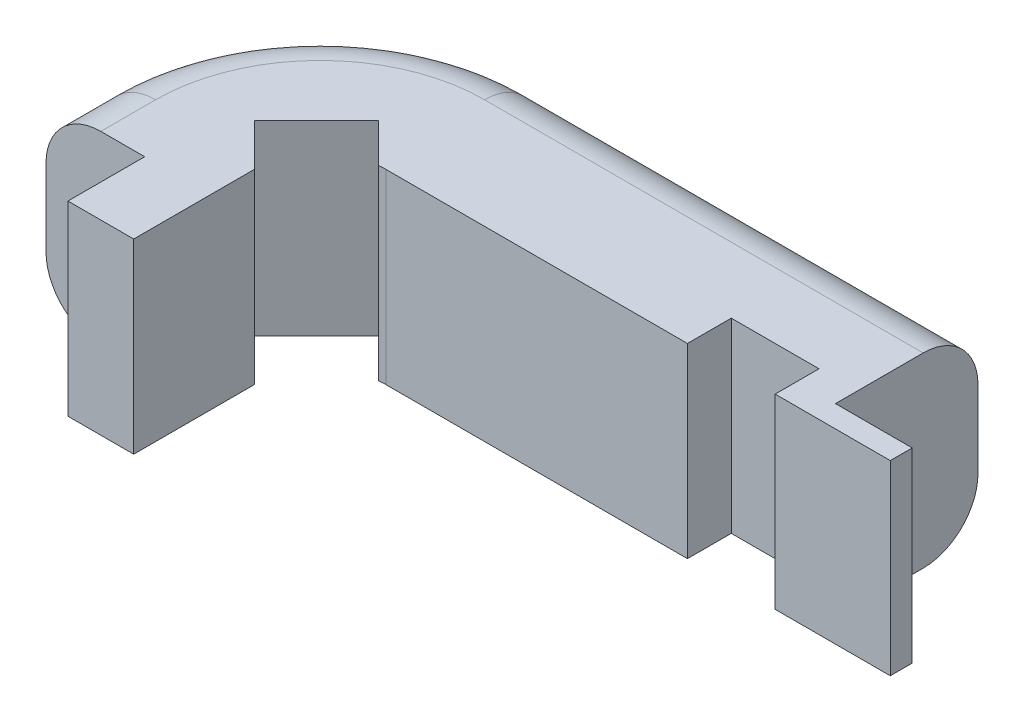
ISO-10303-21;
HEADER;
FILE_DESCRIPTION(('STEP AP214'),'2;1');
FILE_NAME('part.step','',(''),(''),'','','');
FILE_SCHEMA(('AUTOMOTIVE_DESIGN { 1 0 10303 214 1 1 1 1 }'));
ENDSEC;
DATA;
#1=APPLICATION_CONTEXT('core data for automotive mechanical design processes');
#2=APPLICATION_PROTOCOL_DEFINITION('international standard','automotive_design',2000,#1);
#3=PRODUCT_CONTEXT('',#1,'mechanical');
#4=PRODUCT('Part','Part','',(#3));
#5=PRODUCT_RELATED_PRODUCT_CATEGORY('part','',(#4));
#6=PRODUCT_DEFINITION_FORMATION('','',#4);
#7=PRODUCT_DEFINITION_CONTEXT('part definition',#1,'design');
#8=PRODUCT_DEFINITION('design','',#6,#7);
#9=PRODUCT_DEFINITION_SHAPE('','',#8);
#10=(LENGTH_UNIT() NAMED_UNIT(*) SI_UNIT(.MILLI.,.METRE.));
#11=(NAMED_UNIT(*) PLANE_ANGLE_UNIT() SI_UNIT($,.RADIAN.));
#12=(NAMED_UNIT(*) SI_UNIT($,.STERADIAN.) SOLID_ANGLE_UNIT());
#13=UNCERTAINTY_MEASURE_WITH_UNIT(LENGTH_MEASURE(1.E-05),#10,'distance_accuracy_value','');
#14=(GEOMETRIC_REPRESENTATION_CONTEXT(3) GLOBAL_UNCERTAINTY_ASSIGNED_CONTEXT((#13)) GLOBAL_UNIT_ASSIGNED_CONTEXT((#10,
#11,#12)) REPRESENTATION_CONTEXT('',''));
#15=CARTESIAN_POINT('',(0.,0.,0.));
#16=DIRECTION('',(0.,0.,1.));
#17=DIRECTION('',(1.,0.,0.));
#18=AXIS2_PLACEMENT_3D('',#15,#16,#17);
#19=CARTESIAN_POINT('',(0.,-10.,15.));
#20=DIRECTION('',(0.,0.,-1.));
#21=DIRECTION('',(-1.,0.,0.));
#22=AXIS2_PLACEMENT_3D('',#19,#20,#21);
#23=PLANE('',#22);
#24=DIRECTION('',(-1.,0.,0.));
#25=VECTOR('',#24,1.);
#26=CARTESIAN_POINT('',(-40.,0.,15.));
#27=LINE('',#26,#25);
#28=CARTESIAN_POINT('',(-11.5,0.,15.));
#29=VERTEX_POINT('',#28);
#30=CARTESIAN_POINT('',(-39.,0.,15.));
#31=VERTEX_POINT('',#30);
#32=EDGE_CURVE('E296',#29,#31,#27,.T.);
#33=ORIENTED_EDGE('',*,*,#32,.F.);
#34=DIRECTION('',(0.,1.,0.));
#35=VECTOR('',#34,1.);
#36=CARTESIAN_POINT('',(-11.5,-10.,15.));
#37=LINE('',#36,#35);
#38=CARTESIAN_POINT('',(-11.5,17.,15.));
#39=VERTEX_POINT('',#38);
#40=EDGE_CURVE('E11',#29,#39,#37,.T.);
#41=ORIENTED_EDGE('',*,*,#40,.T.);
#42=DIRECTION('',(-1.,0.,0.));
#43=VECTOR('',#42,1.);
#44=CARTESIAN_POINT('',(0.,17.,15.));
#45=LINE('',#44,#43);
#46=CARTESIAN_POINT('',(-39.,17.,15.));
#47=VERTEX_POINT('',#46);
#48=EDGE_CURVE('E279',#39,#47,#45,.T.);
#49=ORIENTED_EDGE('',*,*,#48,.T.);
#50=DIRECTION('',(0.,1.,0.));
#51=VECTOR('',#50,1.);
#52=CARTESIAN_POINT('',(-39.,-10.,15.));
#53=LINE('',#52,#51);
#54=EDGE_CURVE('E288',#31,#47,#53,.T.);
#55=ORIENTED_EDGE('',*,*,#54,.F.);
#56=EDGE_LOOP('',(#33,#41,#49,#55));
#57=FACE_BOUND('',#56,.T.);
#58=ADVANCED_FACE('F38',(#57),#23,.F.);
#59=CARTESIAN_POINT('',(0.,17.,0.));
#60=DIRECTION('',(-1.,0.,0.));
#61=DIRECTION('',(0.,0.,1.));
#62=AXIS2_PLACEMENT_3D('',#59,#60,#61);
#63=PLANE('',#62);
#64=DIRECTION('',(0.,1.,0.));
#65=VECTOR('',#64,1.);
#66=CARTESIAN_POINT('',(0.,17.,13.));
#67=LINE('',#66,#65);
#68=CARTESIAN_POINT('',(0.,0.,13.));
#69=VERTEX_POINT('',#68);
#70=CARTESIAN_POINT('',(0.,17.,13.));
#71=VERTEX_POINT('',#70);
#72=EDGE_CURVE('E61',#69,#71,#67,.T.);
#73=ORIENTED_EDGE('',*,*,#72,.F.);
#74=DIRECTION('',(0.,0.,-1.));
#75=VECTOR('',#74,1.);
#76=CARTESIAN_POINT('',(0.,0.,0.));
#77=LINE('',#76,#75);
#78=CARTESIAN_POINT('',(0.,0.,5.));
#79=VERTEX_POINT('',#78);
#80=EDGE_CURVE('E339',#69,#79,#77,.T.);
#81=ORIENTED_EDGE('',*,*,#80,.T.);
#82=CARTESIAN_POINT('',(0.,5.,5.));
#83=DIRECTION('',(-1.,0.,0.));
#84=DIRECTION('',(0.,0.,-1.));
#85=AXIS2_PLACEMENT_3D('',#82,#83,#84);
#86=CIRCLE('',#85,5.);
#87=CARTESIAN_POINT('',(0.,5.,0.));
#88=VERTEX_POINT('',#87);
#89=EDGE_CURVE('E324',#88,#79,#86,.T.);
#90=ORIENTED_EDGE('',*,*,#89,.F.);
#91=DIRECTION('',(0.,-1.,0.));
#92=VECTOR('',#91,1.);
#93=CARTESIAN_POINT('',(0.,17.,0.));
#94=LINE('',#93,#92);
#95=CARTESIAN_POINT('',(0.,12.,0.));
#96=VERTEX_POINT('',#95);
#97=EDGE_CURVE('E367',#96,#88,#94,.T.);
#98=ORIENTED_EDGE('',*,*,#97,.F.);
#99=CARTESIAN_POINT('',(0.,12.,5.));
#100=DIRECTION('',(-1.,0.,0.));
#101=DIRECTION('',(0.,0.,-1.));
#102=AXIS2_PLACEMENT_3D('',#99,#100,#101);
#103=CIRCLE('',#102,5.);
#104=CARTESIAN_POINT('',(0.,17.,5.));
#105=VERTEX_POINT('',#104);
#106=EDGE_CURVE('E333',#105,#96,#103,.T.);
#107=ORIENTED_EDGE('',*,*,#106,.F.);
#108=DIRECTION('',(0.,0.,-1.));
#109=VECTOR('',#108,1.);
#110=CARTESIAN_POINT('',(0.,17.,0.));
#111=LINE('',#110,#109);
#112=EDGE_CURVE('E350',#71,#105,#111,.T.);
#113=ORIENTED_EDGE('',*,*,#112,.F.);
#114=EDGE_LOOP('',(#73,#81,#90,#98,#107,#113));
#115=FACE_BOUND('',#114,.T.);
#116=ADVANCED_FACE('F40',(#115),#63,.F.);
#117=CARTESIAN_POINT('',(0.,17.,25.));
#118=DIRECTION('',(0.,0.,-1.));
#119=DIRECTION('',(-1.,0.,0.));
#120=AXIS2_PLACEMENT_3D('',#117,#118,#119);
#121=PLANE('',#120);
#122=DIRECTION('',(0.,-1.,0.));
#123=VECTOR('',#122,1.);
#124=CARTESIAN_POINT('',(-51.,17.,25.));
#125=LINE('',#124,#123);
#126=CARTESIAN_POINT('',(-51.,17.,25.));
#127=VERTEX_POINT('',#126);
#128=CARTESIAN_POINT('',(-51.,0.,25.));
#129=VERTEX_POINT('',#128);
#130=EDGE_CURVE('E260',#127,#129,#125,.T.);
#131=ORIENTED_EDGE('',*,*,#130,.F.);
#132=DIRECTION('',(1.,0.,0.));
#133=VECTOR('',#132,1.);
#134=CARTESIAN_POINT('',(0.,17.,25.));
#135=LINE('',#134,#133);
#136=CARTESIAN_POINT('',(-55.,17.,25.));
#137=VERTEX_POINT('',#136);
#138=EDGE_CURVE('E352',#137,#127,#135,.T.);
#139=ORIENTED_EDGE('',*,*,#138,.F.);
#140=CARTESIAN_POINT('',(-55.,12.,25.));
#141=DIRECTION('',(0.,0.,-1.));
#142=DIRECTION('',(-1.,0.,0.));
#143=AXIS2_PLACEMENT_3D('',#140,#141,#142);
#144=CIRCLE('',#143,5.);
#145=CARTESIAN_POINT('',(-60.,12.,25.));
#146=VERTEX_POINT('',#145);
#147=EDGE_CURVE('E312',#137,#146,#144,.F.);
#148=ORIENTED_EDGE('',*,*,#147,.T.);
#149=DIRECTION('',(0.,-1.,0.));
#150=VECTOR('',#149,1.);
#151=CARTESIAN_POINT('',(-60.,17.,25.));
#152=LINE('',#151,#150);
#153=CARTESIAN_POINT('',(-60.,5.,25.));
#154=VERTEX_POINT('',#153);
#155=EDGE_CURVE('E356',#146,#154,#152,.T.);
#156=ORIENTED_EDGE('',*,*,#155,.T.);
#157=CARTESIAN_POINT('',(-55.,5.,25.));
#158=DIRECTION('',(0.,0.,-1.));
#159=DIRECTION('',(-1.,0.,0.));
#160=AXIS2_PLACEMENT_3D('',#157,#158,#159);
#161=CIRCLE('',#160,5.);
#162=CARTESIAN_POINT('',(-55.,0.,25.));
#163=VERTEX_POINT('',#162);
#164=EDGE_CURVE('E302',#154,#163,#161,.F.);
#165=ORIENTED_EDGE('',*,*,#164,.T.);
#166=DIRECTION('',(1.,0.,0.));
#167=VECTOR('',#166,1.);
#168=CARTESIAN_POINT('',(0.,0.,25.));
#169=LINE('',#168,#167);
#170=EDGE_CURVE('E353',#163,#129,#169,.T.);
#171=ORIENTED_EDGE('',*,*,#170,.T.);
#172=EDGE_LOOP('',(#131,#139,#148,#156,#165,#171));
#173=FACE_BOUND('',#172,.T.);
#174=ADVANCED_FACE('F401',(#173),#121,.F.);
#175=CARTESIAN_POINT('',(-40.,17.,20.));
#176=DIRECTION('',(0.,1.,0.));
#177=DIRECTION('',(0.,0.,1.));
#178=AXIS2_PLACEMENT_3D('',#175,#176,#177);
#179=PLANE('',#178);
#180=DIRECTION('',(0.,0.,1.));
#181=VECTOR('',#180,1.);
#182=CARTESIAN_POINT('',(-11.5,17.,20.));
#183=LINE('',#182,#181);
#184=CARTESIAN_POINT('',(-11.5,17.,11.));
#185=VERTEX_POINT('',#184);
#186=EDGE_CURVE('E236',#185,#39,#183,.T.);
#187=ORIENTED_EDGE('',*,*,#186,.F.);
#188=DIRECTION('',(-1.,0.,0.));
#189=VECTOR('',#188,1.);
#190=CARTESIAN_POINT('',(-40.,17.,11.));
#191=LINE('',#190,#189);
#192=CARTESIAN_POINT('',(-3.5,17.,11.));
#193=VERTEX_POINT('',#192);
#194=EDGE_CURVE('E200',#193,#185,#191,.T.);
#195=ORIENTED_EDGE('',*,*,#194,.F.);
#196=DIRECTION('',(0.,0.,-1.));
#197=VECTOR('',#196,1.);
#198=CARTESIAN_POINT('',(-3.5,17.,20.));
#199=LINE('',#198,#197);
#200=CARTESIAN_POINT('',(-3.5,17.,15.));
#201=VERTEX_POINT('',#200);
#202=EDGE_CURVE('E234',#201,#193,#199,.T.);
#203=ORIENTED_EDGE('',*,*,#202,.F.);
#204=CARTESIAN_POINT('',(7.00000000000001,17.,15.));
#205=VERTEX_POINT('',#204);
#206=EDGE_CURVE('E280',#205,#201,#45,.T.);
#207=ORIENTED_EDGE('',*,*,#206,.F.);
#208=DIRECTION('',(0.,0.,1.));
#209=VECTOR('',#208,1.);
#210=CARTESIAN_POINT('',(7.00000000000001,17.,15.));
#211=LINE('',#210,#209);
#212=CARTESIAN_POINT('',(7.00000000000001,17.,13.));
#213=VERTEX_POINT('',#212);
#214=EDGE_CURVE('E250',#213,#205,#211,.T.);
#215=ORIENTED_EDGE('',*,*,#214,.F.);
#216=DIRECTION('',(-1.,0.,0.));
#217=VECTOR('',#216,1.);
#218=CARTESIAN_POINT('',(7.00000000000001,17.,13.));
#219=LINE('',#218,#217);
#220=EDGE_CURVE('E253',#213,#71,#219,.T.);
#221=ORIENTED_EDGE('',*,*,#220,.T.);
#222=ORIENTED_EDGE('',*,*,#112,.T.);
#223=DIRECTION('',(1.,0.,0.));
#224=VECTOR('',#223,1.);
#225=CARTESIAN_POINT('',(-40.,17.,5.00000000000001));
#226=LINE('',#225,#224);
#227=CARTESIAN_POINT('',(-40.,17.,5.00000000000001));
#228=VERTEX_POINT('',#227);
#229=EDGE_CURVE('E336',#228,#105,#226,.T.);
#230=ORIENTED_EDGE('',*,*,#229,.F.);
#231=CARTESIAN_POINT('',(-40.,17.,20.));
#232=DIRECTION('',(0.,-1.,0.));
#233=DIRECTION('',(0.,0.,-1.));
#234=AXIS2_PLACEMENT_3D('',#231,#232,#233);
#235=CIRCLE('',#234,15.);
#236=CARTESIAN_POINT('',(-55.,17.,20.));
#237=VERTEX_POINT('',#236);
#238=EDGE_CURVE('E322',#237,#228,#235,.T.);
#239=ORIENTED_EDGE('',*,*,#238,.F.);
#240=DIRECTION('',(0.,0.,-1.));
#241=VECTOR('',#240,1.);
#242=CARTESIAN_POINT('',(-55.,17.,30.));
#243=LINE('',#242,#241);
#244=EDGE_CURVE('E300',#137,#237,#243,.T.);
#245=ORIENTED_EDGE('',*,*,#244,.F.);
#246=ORIENTED_EDGE('',*,*,#138,.T.);
#247=DIRECTION('',(0.,0.,-1.));
#248=VECTOR('',#247,1.);
#249=CARTESIAN_POINT('',(-51.,17.,32.));
#250=LINE('',#249,#248);
#251=CARTESIAN_POINT('',(-51.,17.,32.));
#252=VERTEX_POINT('',#251);
#253=EDGE_CURVE('E276',#252,#127,#250,.T.);
#254=ORIENTED_EDGE('',*,*,#253,.F.);
#255=DIRECTION('',(-1.,0.,0.));
#256=VECTOR('',#255,1.);
#257=CARTESIAN_POINT('',(-45.,17.,32.));
#258=LINE('',#257,#256);
#259=CARTESIAN_POINT('',(-45.,17.,32.));
#260=VERTEX_POINT('',#259);
#261=EDGE_CURVE('E264',#260,#252,#258,.T.);
#262=ORIENTED_EDGE('',*,*,#261,.F.);
#263=DIRECTION('',(0.,0.,1.));
#264=VECTOR('',#263,1.);
#265=CARTESIAN_POINT('',(-45.,17.,21.));
#266=LINE('',#265,#264);
#267=CARTESIAN_POINT('',(-45.,17.,21.));
#268=VERTEX_POINT('',#267);
#269=EDGE_CURVE('E286',#268,#260,#266,.T.);
#270=ORIENTED_EDGE('',*,*,#269,.F.);
#271=DIRECTION('',(0.707106781186551,0.,0.707106781186544));
#272=VECTOR('',#271,1.);
#273=CARTESIAN_POINT('',(-43.,17.,23.));
#274=LINE('',#273,#272);
#275=CARTESIAN_POINT('',(-48.8432711229671,17.,17.156728877033));
#276=VERTEX_POINT('',#275);
#277=EDGE_CURVE('E217',#276,#268,#274,.T.);
#278=ORIENTED_EDGE('',*,*,#277,.F.);
#279=DIRECTION('',(-0.70710678118654,0.,0.707106781186555));
#280=VECTOR('',#279,1.);
#281=CARTESIAN_POINT('',(-45.8432711229671,17.,14.156728877033));
#282=LINE('',#281,#280);
#283=CARTESIAN_POINT('',(-43.1864168734748,17.,11.4998746275405));
#284=VERTEX_POINT('',#283);
#285=EDGE_CURVE('E240',#284,#276,#282,.T.);
#286=ORIENTED_EDGE('',*,*,#285,.F.);
#287=DIRECTION('',(-0.707106781186551,0.,-0.707106781186544));
#288=VECTOR('',#287,1.);
#289=CARTESIAN_POINT('',(-37.3431457505076,17.,17.3431457505076));
#290=LINE('',#289,#288);
#291=CARTESIAN_POINT('',(-39.650882967542,17.,15.0354085334733));
#292=VERTEX_POINT('',#291);
#293=EDGE_CURVE('E238',#292,#284,#290,.T.);
#294=ORIENTED_EDGE('',*,*,#293,.F.);
#295=CARTESIAN_POINT('',(-39.,17.,21.));
#296=DIRECTION('',(0.,1.,0.));
#297=DIRECTION('',(0.,0.,1.));
#298=AXIS2_PLACEMENT_3D('',#295,#296,#297);
#299=CIRCLE('',#298,6.);
#300=EDGE_CURVE('E283',#47,#292,#299,.T.);
#301=ORIENTED_EDGE('',*,*,#300,.F.);
#302=ORIENTED_EDGE('',*,*,#48,.F.);
#303=EDGE_LOOP('',(#187,#195,#203,#207,#215,#221,#222,#230,#239,#245,#246,#254,#262,#270,#278,
#286,#294,#301,#302));
#304=FACE_BOUND('',#303,.T.);
#305=ADVANCED_FACE('F384',(#304),#179,.T.);
#306=CARTESIAN_POINT('',(-40.,0.,20.));
#307=DIRECTION('',(0.,1.,0.));
#308=DIRECTION('',(0.,0.,1.));
#309=AXIS2_PLACEMENT_3D('',#306,#307,#308);
#310=PLANE('',#309);
#311=DIRECTION('',(1.,0.,0.));
#312=VECTOR('',#311,1.);
#313=CARTESIAN_POINT('',(-11.5,0.,11.));
#314=LINE('',#313,#312);
#315=CARTESIAN_POINT('',(-11.5,0.,11.));
#316=VERTEX_POINT('',#315);
#317=CARTESIAN_POINT('',(-3.5,0.,11.));
#318=VERTEX_POINT('',#317);
#319=EDGE_CURVE('E198',#316,#318,#314,.T.);
#320=ORIENTED_EDGE('',*,*,#319,.F.);
#321=DIRECTION('',(0.,0.,-1.));
#322=VECTOR('',#321,1.);
#323=CARTESIAN_POINT('',(-11.5,0.,15.));
#324=LINE('',#323,#322);
#325=EDGE_CURVE('E206',#29,#316,#324,.T.);
#326=ORIENTED_EDGE('',*,*,#325,.F.);
#327=ORIENTED_EDGE('',*,*,#32,.T.);
#328=CARTESIAN_POINT('',(-39.,0.,21.));
#329=DIRECTION('',(0.,1.,0.));
#330=DIRECTION('',(0.,0.,1.));
#331=AXIS2_PLACEMENT_3D('',#328,#329,#330);
#332=CIRCLE('',#331,6.);
#333=CARTESIAN_POINT('',(-39.650882967542,0.,15.0354085334733));
#334=VERTEX_POINT('',#333);
#335=EDGE_CURVE('E370',#31,#334,#332,.T.);
#336=ORIENTED_EDGE('',*,*,#335,.T.);
#337=DIRECTION('',(0.707106781186551,0.,0.707106781186544));
#338=VECTOR('',#337,1.);
#339=CARTESIAN_POINT('',(-43.1864168734748,0.,11.4998746275405));
#340=LINE('',#339,#338);
#341=CARTESIAN_POINT('',(-43.1864168734748,0.,11.4998746275405));
#342=VERTEX_POINT('',#341);
#343=EDGE_CURVE('E225',#342,#334,#340,.T.);
#344=ORIENTED_EDGE('',*,*,#343,.F.);
#345=DIRECTION('',(0.70710678118654,0.,-0.707106781186555));
#346=VECTOR('',#345,1.);
#347=CARTESIAN_POINT('',(-48.8432711229671,0.,17.156728877033));
#348=LINE('',#347,#346);
#349=CARTESIAN_POINT('',(-48.8432711229671,0.,17.156728877033));
#350=VERTEX_POINT('',#349);
#351=EDGE_CURVE('E222',#350,#342,#348,.T.);
#352=ORIENTED_EDGE('',*,*,#351,.F.);
#353=DIRECTION('',(-0.707106781186551,0.,-0.707106781186544));
#354=VECTOR('',#353,1.);
#355=CARTESIAN_POINT('',(-45.,0.,21.));
#356=LINE('',#355,#354);
#357=CARTESIAN_POINT('',(-45.,0.,21.));
#358=VERTEX_POINT('',#357);
#359=EDGE_CURVE('E219',#358,#350,#356,.T.);
#360=ORIENTED_EDGE('',*,*,#359,.F.);
#361=DIRECTION('',(0.,0.,1.));
#362=VECTOR('',#361,1.);
#363=CARTESIAN_POINT('',(-45.,0.,20.));
#364=LINE('',#363,#362);
#365=CARTESIAN_POINT('',(-45.,0.,32.));
#366=VERTEX_POINT('',#365);
#367=EDGE_CURVE('E292',#358,#366,#364,.T.);
#368=ORIENTED_EDGE('',*,*,#367,.T.);
#369=DIRECTION('',(1.,0.,0.));
#370=VECTOR('',#369,1.);
#371=CARTESIAN_POINT('',(-45.,0.,32.));
#372=LINE('',#371,#370);
#373=CARTESIAN_POINT('',(-51.,0.,32.));
#374=VERTEX_POINT('',#373);
#375=EDGE_CURVE('E268',#374,#366,#372,.T.);
#376=ORIENTED_EDGE('',*,*,#375,.F.);
#377=DIRECTION('',(0.,0.,-1.));
#378=VECTOR('',#377,1.);
#379=CARTESIAN_POINT('',(-51.,0.,32.));
#380=LINE('',#379,#378);
#381=EDGE_CURVE('E271',#374,#129,#380,.T.);
#382=ORIENTED_EDGE('',*,*,#381,.T.);
#383=ORIENTED_EDGE('',*,*,#170,.F.);
#384=DIRECTION('',(0.,0.,-1.));
#385=VECTOR('',#384,1.);
#386=CARTESIAN_POINT('',(-55.,0.,30.));
#387=LINE('',#386,#385);
#388=CARTESIAN_POINT('',(-55.,0.,20.));
#389=VERTEX_POINT('',#388);
#390=EDGE_CURVE('E299',#163,#389,#387,.T.);
#391=ORIENTED_EDGE('',*,*,#390,.T.);
#392=CARTESIAN_POINT('',(-40.,0.,20.));
#393=DIRECTION('',(0.,-1.,0.));
#394=DIRECTION('',(0.,0.,-1.));
#395=AXIS2_PLACEMENT_3D('',#392,#393,#394);
#396=CIRCLE('',#395,15.);
#397=CARTESIAN_POINT('',(-40.,0.,5.00000000000001));
#398=VERTEX_POINT('',#397);
#399=EDGE_CURVE('E326',#389,#398,#396,.T.);
#400=ORIENTED_EDGE('',*,*,#399,.T.);
#401=DIRECTION('',(1.,0.,0.));
#402=VECTOR('',#401,1.);
#403=CARTESIAN_POINT('',(-40.,0.,5.));
#404=LINE('',#403,#402);
#405=EDGE_CURVE('E344',#398,#79,#404,.T.);
#406=ORIENTED_EDGE('',*,*,#405,.T.);
#407=ORIENTED_EDGE('',*,*,#80,.F.);
#408=DIRECTION('',(-1.,0.,0.));
#409=VECTOR('',#408,1.);
#410=CARTESIAN_POINT('',(7.00000000000001,0.,13.));
#411=LINE('',#410,#409);
#412=CARTESIAN_POINT('',(7.00000000000001,0.,13.));
#413=VERTEX_POINT('',#412);
#414=EDGE_CURVE('E257',#413,#69,#411,.T.);
#415=ORIENTED_EDGE('',*,*,#414,.F.);
#416=DIRECTION('',(0.,0.,-1.));
#417=VECTOR('',#416,1.);
#418=CARTESIAN_POINT('',(7.00000000000001,0.,15.));
#419=LINE('',#418,#417);
#420=CARTESIAN_POINT('',(7.00000000000001,0.,15.));
#421=VERTEX_POINT('',#420);
#422=EDGE_CURVE('E246',#421,#413,#419,.T.);
#423=ORIENTED_EDGE('',*,*,#422,.F.);
#424=CARTESIAN_POINT('',(-3.5,0.,15.));
#425=VERTEX_POINT('',#424);
#426=EDGE_CURVE('E297',#421,#425,#27,.T.);
#427=ORIENTED_EDGE('',*,*,#426,.T.);
#428=DIRECTION('',(0.,0.,1.));
#429=VECTOR('',#428,1.);
#430=CARTESIAN_POINT('',(-3.5,0.,15.));
#431=LINE('',#430,#429);
#432=EDGE_CURVE('E53',#318,#425,#431,.T.);
#433=ORIENTED_EDGE('',*,*,#432,.F.);
#434=EDGE_LOOP('',(#320,#326,#327,#336,#344,#352,#360,#368,#376,#382,#383,#391,#400,#406,#407,
#415,#423,#427,#433));
#435=FACE_BOUND('',#434,.T.);
#436=ADVANCED_FACE('F212',(#435),#310,.F.);
#437=CARTESIAN_POINT('',(-60.,17.,20.));
#438=DIRECTION('',(1.,0.,0.));
#439=DIRECTION('',(0.,0.,-1.));
#440=AXIS2_PLACEMENT_3D('',#437,#438,#439);
#441=PLANE('',#440);
#442=DIRECTION('',(0.,0.,-1.));
#443=VECTOR('',#442,1.);
#444=CARTESIAN_POINT('',(-60.,12.,30.0000000000001));
#445=LINE('',#444,#443);
#446=CARTESIAN_POINT('',(-60.,12.,20.0000000000001));
#447=VERTEX_POINT('',#446);
#448=EDGE_CURVE('E303',#146,#447,#445,.T.);
#449=ORIENTED_EDGE('',*,*,#448,.T.);
#450=DIRECTION('',(0.,-1.,0.));
#451=VECTOR('',#450,1.);
#452=CARTESIAN_POINT('',(-60.,17.,20.));
#453=LINE('',#452,#451);
#454=CARTESIAN_POINT('',(-60.,5.,20.0000000000001));
#455=VERTEX_POINT('',#454);
#456=EDGE_CURVE('E361',#447,#455,#453,.T.);
#457=ORIENTED_EDGE('',*,*,#456,.T.);
#458=DIRECTION('',(0.,0.,-1.));
#459=VECTOR('',#458,1.);
#460=CARTESIAN_POINT('',(-60.,5.,30.0000000000001));
#461=LINE('',#460,#459);
#462=EDGE_CURVE('E306',#154,#455,#461,.T.);
#463=ORIENTED_EDGE('',*,*,#462,.F.);
#464=ORIENTED_EDGE('',*,*,#155,.F.);
#465=EDGE_LOOP('',(#449,#457,#463,#464));
#466=FACE_BOUND('',#465,.T.);
#467=ADVANCED_FACE('F473',(#466),#441,.F.);
#468=CARTESIAN_POINT('',(-40.,17.,20.));
#469=DIRECTION('',(0.,-1.,0.));
#470=DIRECTION('',(0.,0.,-1.));
#471=AXIS2_PLACEMENT_3D('',#468,#469,#470);
#472=CYLINDRICAL_SURFACE('',#471,20.);
#473=ORIENTED_EDGE('',*,*,#456,.F.);
#474=CARTESIAN_POINT('',(-40.,12.,20.));
#475=DIRECTION('',(0.,-1.,0.));
#476=DIRECTION('',(0.,0.,-1.));
#477=AXIS2_PLACEMENT_3D('',#474,#475,#476);
#478=CIRCLE('',#477,20.);
#479=CARTESIAN_POINT('',(-40.,12.,0.));
#480=VERTEX_POINT('',#479);
#481=EDGE_CURVE('E318',#447,#480,#478,.T.);
#482=ORIENTED_EDGE('',*,*,#481,.T.);
#483=DIRECTION('',(0.,-1.,0.));
#484=VECTOR('',#483,1.);
#485=CARTESIAN_POINT('',(-40.,17.,0.));
#486=LINE('',#485,#484);
#487=CARTESIAN_POINT('',(-40.,5.,0.));
#488=VERTEX_POINT('',#487);
#489=EDGE_CURVE('E364',#480,#488,#486,.T.);
#490=ORIENTED_EDGE('',*,*,#489,.T.);
#491=CARTESIAN_POINT('',(-40.,5.,20.));
#492=DIRECTION('',(0.,-1.,0.));
#493=DIRECTION('',(0.,0.,-1.));
#494=AXIS2_PLACEMENT_3D('',#491,#492,#493);
#495=CIRCLE('',#494,20.);
#496=EDGE_CURVE('E319',#455,#488,#495,.T.);
#497=ORIENTED_EDGE('',*,*,#496,.F.);
#498=EDGE_LOOP('',(#473,#482,#490,#497));
#499=FACE_BOUND('',#498,.T.);
#500=ADVANCED_FACE('F478',(#499),#472,.T.);
#501=CARTESIAN_POINT('',(0.,17.,0.));
#502=DIRECTION('',(0.,0.,1.));
#503=DIRECTION('',(1.,0.,0.));
#504=AXIS2_PLACEMENT_3D('',#501,#502,#503);
#505=PLANE('',#504);
#506=DIRECTION('',(1.,0.,0.));
#507=VECTOR('',#506,1.);
#508=CARTESIAN_POINT('',(-40.,12.,0.));
#509=LINE('',#508,#507);
#510=EDGE_CURVE('E332',#480,#96,#509,.T.);
#511=ORIENTED_EDGE('',*,*,#510,.T.);
#512=ORIENTED_EDGE('',*,*,#97,.T.);
#513=DIRECTION('',(1.,0.,0.));
#514=VECTOR('',#513,1.);
#515=CARTESIAN_POINT('',(-40.,5.,0.));
#516=LINE('',#515,#514);
#517=EDGE_CURVE('E335',#488,#88,#516,.T.);
#518=ORIENTED_EDGE('',*,*,#517,.F.);
#519=ORIENTED_EDGE('',*,*,#489,.F.);
#520=EDGE_LOOP('',(#511,#512,#518,#519));
#521=FACE_BOUND('',#520,.T.);
#522=ADVANCED_FACE('F490',(#521),#505,.F.);
#523=CARTESIAN_POINT('',(-40.,5.,5.00000000000001));
#524=DIRECTION('',(1.,0.,0.));
#525=DIRECTION('',(0.,0.,-1.));
#526=AXIS2_PLACEMENT_3D('',#523,#524,#525);
#527=CYLINDRICAL_SURFACE('',#526,5.);
#528=ORIENTED_EDGE('',*,*,#89,.T.);
#529=ORIENTED_EDGE('',*,*,#405,.F.);
#530=CARTESIAN_POINT('',(-40.,5.,5.00000000000001));
#531=DIRECTION('',(-1.,0.,0.));
#532=DIRECTION('',(0.,0.,-1.));
#533=AXIS2_PLACEMENT_3D('',#530,#531,#532);
#534=CIRCLE('',#533,5.);
#535=EDGE_CURVE('E342',#488,#398,#534,.T.);
#536=ORIENTED_EDGE('',*,*,#535,.F.);
#537=ORIENTED_EDGE('',*,*,#517,.T.);
#538=EDGE_LOOP('',(#528,#529,#536,#537));
#539=FACE_BOUND('',#538,.T.);
#540=ADVANCED_FACE('F487',(#539),#527,.T.);
#541=CARTESIAN_POINT('',(-40.,12.,5.));
#542=DIRECTION('',(1.,0.,0.));
#543=DIRECTION('',(0.,0.,-1.));
#544=AXIS2_PLACEMENT_3D('',#541,#542,#543);
#545=CYLINDRICAL_SURFACE('',#544,5.);
#546=ORIENTED_EDGE('',*,*,#106,.T.);
#547=ORIENTED_EDGE('',*,*,#510,.F.);
#548=CARTESIAN_POINT('',(-40.,12.,5.));
#549=DIRECTION('',(-1.,0.,0.));
#550=DIRECTION('',(0.,0.,-1.));
#551=AXIS2_PLACEMENT_3D('',#548,#549,#550);
#552=CIRCLE('',#551,5.);
#553=EDGE_CURVE('E330',#228,#480,#552,.T.);
#554=ORIENTED_EDGE('',*,*,#553,.F.);
#555=ORIENTED_EDGE('',*,*,#229,.T.);
#556=EDGE_LOOP('',(#546,#547,#554,#555));
#557=FACE_BOUND('',#556,.T.);
#558=ADVANCED_FACE('F494',(#557),#545,.T.);
#559=CARTESIAN_POINT('',(-40.,12.,20.));
#560=DIRECTION('',(0.,-1.,0.));
#561=DIRECTION('',(0.,0.,-1.));
#562=AXIS2_PLACEMENT_3D('',#559,#560,#561);
#563=TOROIDAL_SURFACE('',#562,15.,5.);
#564=ORIENTED_EDGE('',*,*,#238,.T.);
#565=ORIENTED_EDGE('',*,*,#553,.T.);
#566=ORIENTED_EDGE('',*,*,#481,.F.);
#567=CARTESIAN_POINT('',(-55.,12.,20.));
#568=DIRECTION('',(0.,0.,1.));
#569=DIRECTION('',(-1.,0.,0.));
#570=AXIS2_PLACEMENT_3D('',#567,#568,#569);
#571=CIRCLE('',#570,5.);
#572=EDGE_CURVE('E316',#237,#447,#571,.T.);
#573=ORIENTED_EDGE('',*,*,#572,.F.);
#574=EDGE_LOOP('',(#564,#565,#566,#573));
#575=FACE_BOUND('',#574,.T.);
#576=ADVANCED_FACE('F501',(#575),#563,.T.);
#577=CARTESIAN_POINT('',(-40.,5.,20.));
#578=DIRECTION('',(0.,-1.,0.));
#579=DIRECTION('',(0.,0.,-1.));
#580=AXIS2_PLACEMENT_3D('',#577,#578,#579);
#581=TOROIDAL_SURFACE('',#580,15.,5.);
#582=ORIENTED_EDGE('',*,*,#496,.T.);
#583=ORIENTED_EDGE('',*,*,#535,.T.);
#584=ORIENTED_EDGE('',*,*,#399,.F.);
#585=CARTESIAN_POINT('',(-55.,5.,20.));
#586=DIRECTION('',(0.,0.,1.));
#587=DIRECTION('',(-1.,0.,0.));
#588=AXIS2_PLACEMENT_3D('',#585,#586,#587);
#589=CIRCLE('',#588,5.);
#590=EDGE_CURVE('E315',#455,#389,#589,.T.);
#591=ORIENTED_EDGE('',*,*,#590,.F.);
#592=EDGE_LOOP('',(#582,#583,#584,#591));
#593=FACE_BOUND('',#592,.T.);
#594=ADVANCED_FACE('F483',(#593),#581,.T.);
#595=CARTESIAN_POINT('',(-55.,5.,30.));
#596=DIRECTION('',(0.,0.,-1.));
#597=DIRECTION('',(-1.,0.,0.));
#598=AXIS2_PLACEMENT_3D('',#595,#596,#597);
#599=CYLINDRICAL_SURFACE('',#598,5.);
#600=ORIENTED_EDGE('',*,*,#462,.T.);
#601=ORIENTED_EDGE('',*,*,#590,.T.);
#602=ORIENTED_EDGE('',*,*,#390,.F.);
#603=ORIENTED_EDGE('',*,*,#164,.F.);
#604=EDGE_LOOP('',(#600,#601,#602,#603));
#605=FACE_BOUND('',#604,.T.);
#606=ADVANCED_FACE('F419',(#605),#599,.T.);
#607=CARTESIAN_POINT('',(-55.,12.,30.));
#608=DIRECTION('',(0.,0.,-1.));
#609=DIRECTION('',(-1.,0.,0.));
#610=AXIS2_PLACEMENT_3D('',#607,#608,#609);
#611=CYLINDRICAL_SURFACE('',#610,5.);
#612=ORIENTED_EDGE('',*,*,#244,.T.);
#613=ORIENTED_EDGE('',*,*,#572,.T.);
#614=ORIENTED_EDGE('',*,*,#448,.F.);
#615=ORIENTED_EDGE('',*,*,#147,.F.);
#616=EDGE_LOOP('',(#612,#613,#614,#615));
#617=FACE_BOUND('',#616,.T.);
#618=ADVANCED_FACE('F414',(#617),#611,.T.);
#619=CARTESIAN_POINT('',(-39.,-10.,21.));
#620=DIRECTION('',(0.,1.,0.));
#621=DIRECTION('',(0.,0.,1.));
#622=AXIS2_PLACEMENT_3D('',#619,#620,#621);
#623=CYLINDRICAL_SURFACE('',#622,6.);
#624=ORIENTED_EDGE('',*,*,#300,.T.);
#625=DIRECTION('',(0.,-1.,0.));
#626=VECTOR('',#625,1.);
#627=CARTESIAN_POINT('',(-39.650882967542,23.,15.0354085334733));
#628=LINE('',#627,#626);
#629=EDGE_CURVE('E210',#292,#334,#628,.T.);
#630=ORIENTED_EDGE('',*,*,#629,.T.);
#631=ORIENTED_EDGE('',*,*,#335,.F.);
#632=ORIENTED_EDGE('',*,*,#54,.T.);
#633=EDGE_LOOP('',(#624,#630,#631,#632));
#634=FACE_BOUND('',#633,.T.);
#635=ADVANCED_FACE('F406',(#634),#623,.F.);
#636=ORIENTED_EDGE('',*,*,#206,.T.);
#637=DIRECTION('',(0.,-1.,0.));
#638=VECTOR('',#637,1.);
#639=CARTESIAN_POINT('',(-3.5,-10.,15.));
#640=LINE('',#639,#638);
#641=EDGE_CURVE('E46',#201,#425,#640,.T.);
#642=ORIENTED_EDGE('',*,*,#641,.T.);
#643=ORIENTED_EDGE('',*,*,#426,.F.);
#644=DIRECTION('',(0.,-1.,0.));
#645=VECTOR('',#644,1.);
#646=CARTESIAN_POINT('',(7.00000000000001,17.,15.));
#647=LINE('',#646,#645);
#648=EDGE_CURVE('E243',#205,#421,#647,.T.);
#649=ORIENTED_EDGE('',*,*,#648,.F.);
#650=EDGE_LOOP('',(#636,#642,#643,#649));
#651=FACE_BOUND('',#650,.T.);
#652=ADVANCED_FACE('F373',(#651),#23,.F.);
#653=CARTESIAN_POINT('',(-45.,-10.,21.));
#654=DIRECTION('',(-1.,0.,0.));
#655=DIRECTION('',(0.,0.,1.));
#656=AXIS2_PLACEMENT_3D('',#653,#654,#655);
#657=PLANE('',#656);
#658=DIRECTION('',(0.,1.,0.));
#659=VECTOR('',#658,1.);
#660=CARTESIAN_POINT('',(-45.,-10.,21.));
#661=LINE('',#660,#659);
#662=EDGE_CURVE('E289',#358,#268,#661,.T.);
#663=ORIENTED_EDGE('',*,*,#662,.T.);
#664=ORIENTED_EDGE('',*,*,#269,.T.);
#665=DIRECTION('',(0.,1.,0.));
#666=VECTOR('',#665,1.);
#667=CARTESIAN_POINT('',(-45.,17.,32.));
#668=LINE('',#667,#666);
#669=EDGE_CURVE('E261',#366,#260,#668,.T.);
#670=ORIENTED_EDGE('',*,*,#669,.F.);
#671=ORIENTED_EDGE('',*,*,#367,.F.);
#672=EDGE_LOOP('',(#663,#664,#670,#671));
#673=FACE_BOUND('',#672,.T.);
#674=ADVANCED_FACE('F405',(#673),#657,.F.);
#675=CARTESIAN_POINT('',(-51.,17.,32.));
#676=DIRECTION('',(1.,0.,0.));
#677=DIRECTION('',(0.,0.,-1.));
#678=AXIS2_PLACEMENT_3D('',#675,#676,#677);
#679=PLANE('',#678);
#680=ORIENTED_EDGE('',*,*,#130,.T.);
#681=ORIENTED_EDGE('',*,*,#381,.F.);
#682=DIRECTION('',(0.,-1.,0.));
#683=VECTOR('',#682,1.);
#684=CARTESIAN_POINT('',(-51.,17.,32.));
#685=LINE('',#684,#683);
#686=EDGE_CURVE('E266',#252,#374,#685,.T.);
#687=ORIENTED_EDGE('',*,*,#686,.F.);
#688=ORIENTED_EDGE('',*,*,#253,.T.);
#689=EDGE_LOOP('',(#680,#681,#687,#688));
#690=FACE_BOUND('',#689,.T.);
#691=ADVANCED_FACE('F411',(#690),#679,.F.);
#692=CARTESIAN_POINT('',(0.,0.,32.));
#693=DIRECTION('',(0.,0.,-1.));
#694=DIRECTION('',(-1.,0.,0.));
#695=AXIS2_PLACEMENT_3D('',#692,#693,#694);
#696=PLANE('',#695);
#697=ORIENTED_EDGE('',*,*,#669,.T.);
#698=ORIENTED_EDGE('',*,*,#261,.T.);
#699=ORIENTED_EDGE('',*,*,#686,.T.);
#700=ORIENTED_EDGE('',*,*,#375,.T.);
#701=EDGE_LOOP('',(#697,#698,#699,#700));
#702=FACE_BOUND('',#701,.T.);
#703=ADVANCED_FACE('F424',(#702),#696,.F.);
#704=CARTESIAN_POINT('',(7.00000000000001,17.,13.));
#705=DIRECTION('',(0.,0.,1.));
#706=DIRECTION('',(1.,0.,0.));
#707=AXIS2_PLACEMENT_3D('',#704,#705,#706);
#708=PLANE('',#707);
#709=ORIENTED_EDGE('',*,*,#72,.T.);
#710=ORIENTED_EDGE('',*,*,#220,.F.);
#711=DIRECTION('',(0.,1.,0.));
#712=VECTOR('',#711,1.);
#713=CARTESIAN_POINT('',(7.00000000000001,17.,13.));
#714=LINE('',#713,#712);
#715=EDGE_CURVE('E248',#413,#213,#714,.T.);
#716=ORIENTED_EDGE('',*,*,#715,.F.);
#717=ORIENTED_EDGE('',*,*,#414,.T.);
#718=EDGE_LOOP('',(#709,#710,#716,#717));
#719=FACE_BOUND('',#718,.T.);
#720=ADVANCED_FACE('F428',(#719),#708,.F.);
#721=CARTESIAN_POINT('',(7.00000000000001,0.,0.));
#722=DIRECTION('',(1.,0.,0.));
#723=DIRECTION('',(0.,0.,-1.));
#724=AXIS2_PLACEMENT_3D('',#721,#722,#723);
#725=PLANE('',#724);
#726=ORIENTED_EDGE('',*,*,#648,.T.);
#727=ORIENTED_EDGE('',*,*,#422,.T.);
#728=ORIENTED_EDGE('',*,*,#715,.T.);
#729=ORIENTED_EDGE('',*,*,#214,.T.);
#730=EDGE_LOOP('',(#726,#727,#728,#729));
#731=FACE_BOUND('',#730,.T.);
#732=ADVANCED_FACE('F380',(#731),#725,.T.);
#733=CARTESIAN_POINT('',(-43.1864168734748,23.,11.4998746275405));
#734=DIRECTION('',(0.707106781186544,0.,-0.707106781186551));
#735=DIRECTION('',(-0.707106781186551,0.,-0.707106781186544));
#736=AXIS2_PLACEMENT_3D('',#733,#734,#735);
#737=PLANE('',#736);
#738=ORIENTED_EDGE('',*,*,#293,.T.);
#739=DIRECTION('',(0.,-1.,0.));
#740=VECTOR('',#739,1.);
#741=CARTESIAN_POINT('',(-43.1864168734748,23.,11.4998746275405));
#742=LINE('',#741,#740);
#743=EDGE_CURVE('E230',#284,#342,#742,.T.);
#744=ORIENTED_EDGE('',*,*,#743,.T.);
#745=ORIENTED_EDGE('',*,*,#343,.T.);
#746=ORIENTED_EDGE('',*,*,#629,.F.);
#747=EDGE_LOOP('',(#738,#744,#745,#746));
#748=FACE_BOUND('',#747,.T.);
#749=ADVANCED_FACE('F435',(#748),#737,.F.);
#750=CARTESIAN_POINT('',(-48.8432711229671,23.,17.156728877033));
#751=DIRECTION('',(-0.707106781186555,0.,-0.70710678118654));
#752=DIRECTION('',(-0.70710678118654,0.,0.707106781186555));
#753=AXIS2_PLACEMENT_3D('',#750,#751,#752);
#754=PLANE('',#753);
#755=ORIENTED_EDGE('',*,*,#285,.T.);
#756=DIRECTION('',(0.,-1.,0.));
#757=VECTOR('',#756,1.);
#758=CARTESIAN_POINT('',(-48.8432711229671,23.,17.156728877033));
#759=LINE('',#758,#757);
#760=EDGE_CURVE('E227',#276,#350,#759,.T.);
#761=ORIENTED_EDGE('',*,*,#760,.T.);
#762=ORIENTED_EDGE('',*,*,#351,.T.);
#763=ORIENTED_EDGE('',*,*,#743,.F.);
#764=EDGE_LOOP('',(#755,#761,#762,#763));
#765=FACE_BOUND('',#764,.T.);
#766=ADVANCED_FACE('F438',(#765),#754,.F.);
#767=CARTESIAN_POINT('',(-45.,23.,21.));
#768=DIRECTION('',(-0.707106781186544,0.,0.707106781186551));
#769=DIRECTION('',(0.707106781186551,0.,0.707106781186544));
#770=AXIS2_PLACEMENT_3D('',#767,#768,#769);
#771=PLANE('',#770);
#772=ORIENTED_EDGE('',*,*,#277,.T.);
#773=ORIENTED_EDGE('',*,*,#662,.F.);
#774=ORIENTED_EDGE('',*,*,#359,.T.);
#775=ORIENTED_EDGE('',*,*,#760,.F.);
#776=EDGE_LOOP('',(#772,#773,#774,#775));
#777=FACE_BOUND('',#776,.T.);
#778=ADVANCED_FACE('F393',(#777),#771,.F.);
#779=CARTESIAN_POINT('',(-11.5,23.,15.));
#780=DIRECTION('',(-1.,0.,0.));
#781=DIRECTION('',(0.,0.,1.));
#782=AXIS2_PLACEMENT_3D('',#779,#780,#781);
#783=PLANE('',#782);
#784=ORIENTED_EDGE('',*,*,#186,.T.);
#785=ORIENTED_EDGE('',*,*,#40,.F.);
#786=ORIENTED_EDGE('',*,*,#325,.T.);
#787=DIRECTION('',(0.,-1.,0.));
#788=VECTOR('',#787,1.);
#789=CARTESIAN_POINT('',(-11.5,23.,11.));
#790=LINE('',#789,#788);
#791=EDGE_CURVE('E193',#185,#316,#790,.T.);
#792=ORIENTED_EDGE('',*,*,#791,.F.);
#793=EDGE_LOOP('',(#784,#785,#786,#792));
#794=FACE_BOUND('',#793,.T.);
#795=ADVANCED_FACE('F207',(#794),#783,.F.);
#796=CARTESIAN_POINT('',(-3.5,23.,15.));
#797=DIRECTION('',(1.,0.,0.));
#798=DIRECTION('',(0.,0.,-1.));
#799=AXIS2_PLACEMENT_3D('',#796,#797,#798);
#800=PLANE('',#799);
#801=ORIENTED_EDGE('',*,*,#202,.T.);
#802=DIRECTION('',(0.,-1.,0.));
#803=VECTOR('',#802,1.);
#804=CARTESIAN_POINT('',(-3.5,23.,11.));
#805=LINE('',#804,#803);
#806=EDGE_CURVE('E203',#193,#318,#805,.T.);
#807=ORIENTED_EDGE('',*,*,#806,.T.);
#808=ORIENTED_EDGE('',*,*,#432,.T.);
#809=ORIENTED_EDGE('',*,*,#641,.F.);
#810=EDGE_LOOP('',(#801,#807,#808,#809));
#811=FACE_BOUND('',#810,.T.);
#812=ADVANCED_FACE('F385',(#811),#800,.F.);
#813=CARTESIAN_POINT('',(-11.5,23.,11.));
#814=DIRECTION('',(0.,0.,-1.));
#815=DIRECTION('',(-1.,0.,0.));
#816=AXIS2_PLACEMENT_3D('',#813,#814,#815);
#817=PLANE('',#816);
#818=ORIENTED_EDGE('',*,*,#194,.T.);
#819=ORIENTED_EDGE('',*,*,#791,.T.);
#820=ORIENTED_EDGE('',*,*,#319,.T.);
#821=ORIENTED_EDGE('',*,*,#806,.F.);
#822=EDGE_LOOP('',(#818,#819,#820,#821));
#823=FACE_BOUND('',#822,.T.);
#824=ADVANCED_FACE('F195',(#823),#817,.F.);
#825=CLOSED_SHELL('',(#58,#116,#174,#305,#436,#467,#500,#522,#540,#558,#576,#594,#606,#618,#635,
#652,#674,#691,#703,#720,#732,#749,#766,#778,#795,#812,#824));
#826=MANIFOLD_SOLID_BREP('B2',#825);
#827=ADVANCED_BREP_SHAPE_REPRESENTATION('',(#18,#826),#14);
#828=SHAPE_DEFINITION_REPRESENTATION(#9,#827);
ENDSEC;
END-ISO-10303-21;
